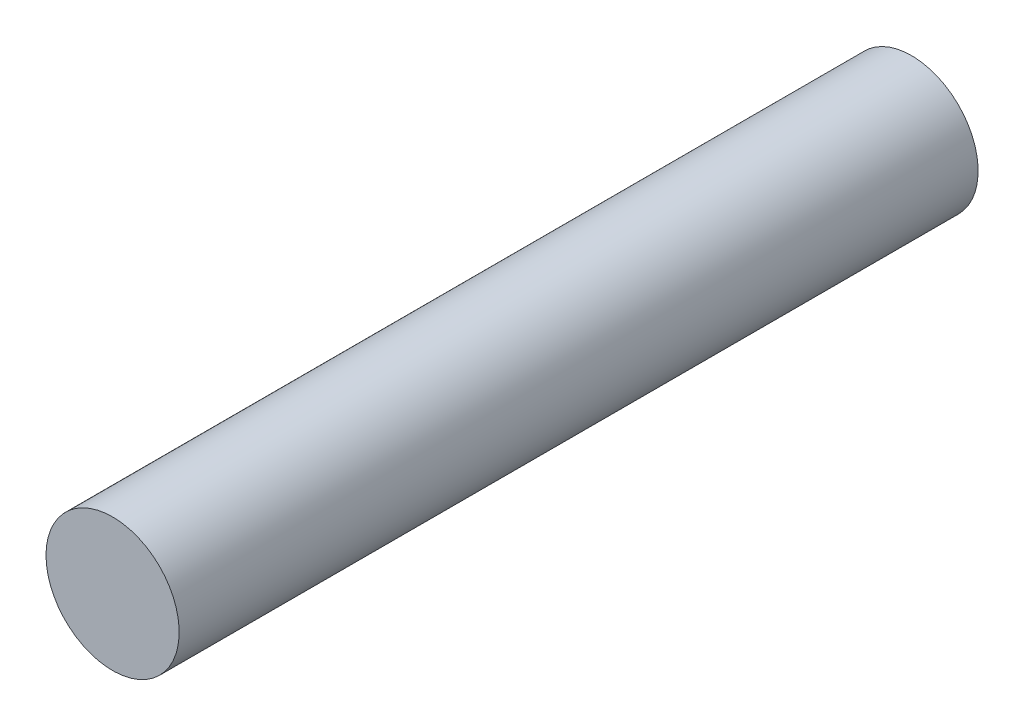
ISO-10303-21;
HEADER;
FILE_DESCRIPTION(('STEP AP214'),'2;1');
FILE_NAME('part.step','',(''),(''),'','','');
FILE_SCHEMA(('AUTOMOTIVE_DESIGN { 1 0 10303 214 1 1 1 1 }'));
ENDSEC;
DATA;
#1=APPLICATION_CONTEXT('core data for automotive mechanical design processes');
#2=APPLICATION_PROTOCOL_DEFINITION('international standard','automotive_design',2000,#1);
#3=PRODUCT_CONTEXT('',#1,'mechanical');
#4=PRODUCT('Part','Part','',(#3));
#5=PRODUCT_RELATED_PRODUCT_CATEGORY('part','',(#4));
#6=PRODUCT_DEFINITION_FORMATION('','',#4);
#7=PRODUCT_DEFINITION_CONTEXT('part definition',#1,'design');
#8=PRODUCT_DEFINITION('design','',#6,#7);
#9=PRODUCT_DEFINITION_SHAPE('','',#8);
#10=(LENGTH_UNIT() NAMED_UNIT(*) SI_UNIT(.MILLI.,.METRE.));
#11=(NAMED_UNIT(*) PLANE_ANGLE_UNIT() SI_UNIT($,.RADIAN.));
#12=(NAMED_UNIT(*) SI_UNIT($,.STERADIAN.) SOLID_ANGLE_UNIT());
#13=UNCERTAINTY_MEASURE_WITH_UNIT(LENGTH_MEASURE(1.E-05),#10,'distance_accuracy_value','');
#14=(GEOMETRIC_REPRESENTATION_CONTEXT(3) GLOBAL_UNCERTAINTY_ASSIGNED_CONTEXT((#13)) GLOBAL_UNIT_ASSIGNED_CONTEXT((#10,
#11,#12)) REPRESENTATION_CONTEXT('',''));
#15=CARTESIAN_POINT('',(0.,0.,0.));
#16=DIRECTION('',(0.,0.,1.));
#17=DIRECTION('',(1.,0.,0.));
#18=AXIS2_PLACEMENT_3D('',#15,#16,#17);
#19=CARTESIAN_POINT('',(0.,0.,76.2));
#20=DIRECTION('',(0.,0.,-1.));
#21=DIRECTION('',(-1.,0.,0.));
#22=AXIS2_PLACEMENT_3D('',#19,#20,#21);
#23=CYLINDRICAL_SURFACE('',#22,6.35);
#24=CARTESIAN_POINT('',(0.,0.,76.2));
#25=DIRECTION('',(0.,0.,1.));
#26=DIRECTION('',(1.,0.,0.));
#27=AXIS2_PLACEMENT_3D('',#24,#25,#26);
#28=CIRCLE('',#27,6.35);
#29=CARTESIAN_POINT('',(-6.35,0.,76.2));
#30=VERTEX_POINT('',#29);
#31=EDGE_CURVE('E10',#30,#30,#28,.T.);
#32=CARTESIAN_POINT('',(0.,0.,0.));
#33=DIRECTION('',(0.,0.,1.));
#34=DIRECTION('',(1.,0.,0.));
#35=AXIS2_PLACEMENT_3D('',#32,#33,#34);
#36=CIRCLE('',#35,6.35);
#37=CARTESIAN_POINT('',(-6.35,0.,0.));
#38=VERTEX_POINT('',#37);
#39=EDGE_CURVE('E34',#38,#38,#36,.T.);
#40=CARTESIAN_POINT('',(-6.35,0.,76.2));
#41=CARTESIAN_POINT('',(-6.35,0.,75.40625));
#42=CARTESIAN_POINT('',(-6.35,0.,74.6125));
#43=CARTESIAN_POINT('',(-6.35,0.,73.025));
#44=CARTESIAN_POINT('',(-6.35,0.,72.23125));
#45=CARTESIAN_POINT('',(-6.35,0.,70.64375));
#46=CARTESIAN_POINT('',(-6.35,0.,69.85));
#47=CARTESIAN_POINT('',(-6.35,0.,68.2625));
#48=CARTESIAN_POINT('',(-6.35,0.,67.46875));
#49=CARTESIAN_POINT('',(-6.35,0.,65.88125));
#50=CARTESIAN_POINT('',(-6.35,0.,65.0875));
#51=CARTESIAN_POINT('',(-6.35,0.,63.5));
#52=CARTESIAN_POINT('',(-6.35,0.,62.70625));
#53=CARTESIAN_POINT('',(-6.35,0.,61.11875));
#54=CARTESIAN_POINT('',(-6.35,0.,60.325));
#55=CARTESIAN_POINT('',(-6.35,0.,58.7375));
#56=CARTESIAN_POINT('',(-6.35,0.,57.94375));
#57=CARTESIAN_POINT('',(-6.35,0.,56.35625));
#58=CARTESIAN_POINT('',(-6.35,0.,55.5625));
#59=CARTESIAN_POINT('',(-6.35,0.,53.975));
#60=CARTESIAN_POINT('',(-6.35,0.,53.18125));
#61=CARTESIAN_POINT('',(-6.35,0.,51.59375));
#62=CARTESIAN_POINT('',(-6.35,0.,50.8));
#63=CARTESIAN_POINT('',(-6.35,0.,49.2125));
#64=CARTESIAN_POINT('',(-6.35,0.,48.41875));
#65=CARTESIAN_POINT('',(-6.35,0.,46.83125));
#66=CARTESIAN_POINT('',(-6.35,0.,46.0375));
#67=CARTESIAN_POINT('',(-6.35,0.,44.45));
#68=CARTESIAN_POINT('',(-6.35,0.,43.65625));
#69=CARTESIAN_POINT('',(-6.35,0.,42.06875));
#70=CARTESIAN_POINT('',(-6.35,0.,41.275));
#71=CARTESIAN_POINT('',(-6.35,0.,39.6875));
#72=CARTESIAN_POINT('',(-6.35,0.,38.89375));
#73=CARTESIAN_POINT('',(-6.35,0.,37.30625));
#74=CARTESIAN_POINT('',(-6.35,0.,36.5125));
#75=CARTESIAN_POINT('',(-6.35,0.,34.925));
#76=CARTESIAN_POINT('',(-6.35,0.,34.13125));
#77=CARTESIAN_POINT('',(-6.35,0.,32.54375));
#78=CARTESIAN_POINT('',(-6.35,0.,31.75));
#79=CARTESIAN_POINT('',(-6.35,0.,30.1625));
#80=CARTESIAN_POINT('',(-6.35,0.,29.36875));
#81=CARTESIAN_POINT('',(-6.35,0.,27.78125));
#82=CARTESIAN_POINT('',(-6.35,0.,26.9875));
#83=CARTESIAN_POINT('',(-6.35,0.,25.4));
#84=CARTESIAN_POINT('',(-6.35,0.,24.60625));
#85=CARTESIAN_POINT('',(-6.35,0.,23.01875));
#86=CARTESIAN_POINT('',(-6.35,0.,22.225));
#87=CARTESIAN_POINT('',(-6.35,0.,20.6375));
#88=CARTESIAN_POINT('',(-6.35,0.,19.84375));
#89=CARTESIAN_POINT('',(-6.35,0.,18.25625));
#90=CARTESIAN_POINT('',(-6.35,0.,17.4625));
#91=CARTESIAN_POINT('',(-6.35,0.,15.875));
#92=CARTESIAN_POINT('',(-6.35,0.,15.08125));
#93=CARTESIAN_POINT('',(-6.35,0.,13.49375));
#94=CARTESIAN_POINT('',(-6.35,0.,12.7));
#95=CARTESIAN_POINT('',(-6.35,0.,11.1125));
#96=CARTESIAN_POINT('',(-6.35,0.,10.31875));
#97=CARTESIAN_POINT('',(-6.35,0.,8.73125));
#98=CARTESIAN_POINT('',(-6.35,0.,7.93750000000001));
#99=CARTESIAN_POINT('',(-6.35,0.,6.35));
#100=CARTESIAN_POINT('',(-6.35,0.,5.55625));
#101=CARTESIAN_POINT('',(-6.35,0.,3.96875));
#102=CARTESIAN_POINT('',(-6.35,0.,3.175));
#103=CARTESIAN_POINT('',(-6.35,0.,1.5875));
#104=CARTESIAN_POINT('',(-6.35,0.,0.793750000000001));
#105=CARTESIAN_POINT('',(-6.35,0.,0.));
#106=B_SPLINE_CURVE_WITH_KNOTS('',3,(#40,#41,#42,#43,#44,#45,#46,#47,#48,#49,#50,#51,#52,#53,
#54,#55,#56,#57,#58,#59,#60,#61,#62,#63,#64,#65,#66,#67,#68,#69,#70,#71,#72,#73,#74,#75,#76,#77,
#78,#79,#80,#81,#82,#83,#84,#85,#86,#87,#88,#89,#90,#91,#92,#93,#94,#95,#96,#97,#98,#99,#100,
#101,#102,#103,#104,#105),.UNSPECIFIED.,.F.,.F.,(4,2,2,2,2,2,2,2,2,2,2,2,2,2,2,2,2,2,2,2,2,2,2,
2,2,2,2,2,2,2,2,2,4),(0.,2.38124999999999,4.76249999999999,7.14374999999999,9.52499999999999,
11.90625,14.2875,16.66875,19.05,21.43125,23.8125,26.19375,28.575,30.95625,33.3375,35.71875,38.1,
40.48125,42.8625,45.24375,47.625,50.00625,52.3875,54.76875,57.15,59.53125,61.9125,64.29375,
66.675,69.05625,71.4375,73.81875,76.2),.UNSPECIFIED.);
#107=EDGE_CURVE('BSEAM31',#30,#38,#106,.T.);
#108=ORIENTED_EDGE('',*,*,#31,.F.);
#109=ORIENTED_EDGE('',*,*,#39,.T.);
#110=ORIENTED_EDGE('',*,*,#107,.T.);
#111=ORIENTED_EDGE('',*,*,#107,.F.);
#112=EDGE_LOOP('',(#108,#110,#109,#111));
#113=FACE_BOUND('',#112,.T.);
#114=ADVANCED_FACE('F31',(#113),#23,.T.);
#115=CARTESIAN_POINT('',(0.,0.,76.2));
#116=DIRECTION('',(0.,0.,1.));
#117=DIRECTION('',(1.,0.,0.));
#118=AXIS2_PLACEMENT_3D('',#115,#116,#117);
#119=PLANE('',#118);
#120=ORIENTED_EDGE('',*,*,#31,.T.);
#121=EDGE_LOOP('',(#120));
#122=FACE_BOUND('',#121,.T.);
#123=ADVANCED_FACE('F46',(#122),#119,.T.);
#124=CARTESIAN_POINT('',(0.,0.,0.));
#125=DIRECTION('',(0.,0.,1.));
#126=DIRECTION('',(1.,0.,0.));
#127=AXIS2_PLACEMENT_3D('',#124,#125,#126);
#128=PLANE('',#127);
#129=ORIENTED_EDGE('',*,*,#39,.F.);
#130=EDGE_LOOP('',(#129));
#131=FACE_BOUND('',#130,.T.);
#132=ADVANCED_FACE('F44',(#131),#128,.F.);
#133=CLOSED_SHELL('',(#114,#123,#132));
#134=MANIFOLD_SOLID_BREP('B2',#133);
#135=ADVANCED_BREP_SHAPE_REPRESENTATION('',(#18,#134),#14);
#136=SHAPE_DEFINITION_REPRESENTATION(#9,#135);
ENDSEC;
END-ISO-10303-21;
